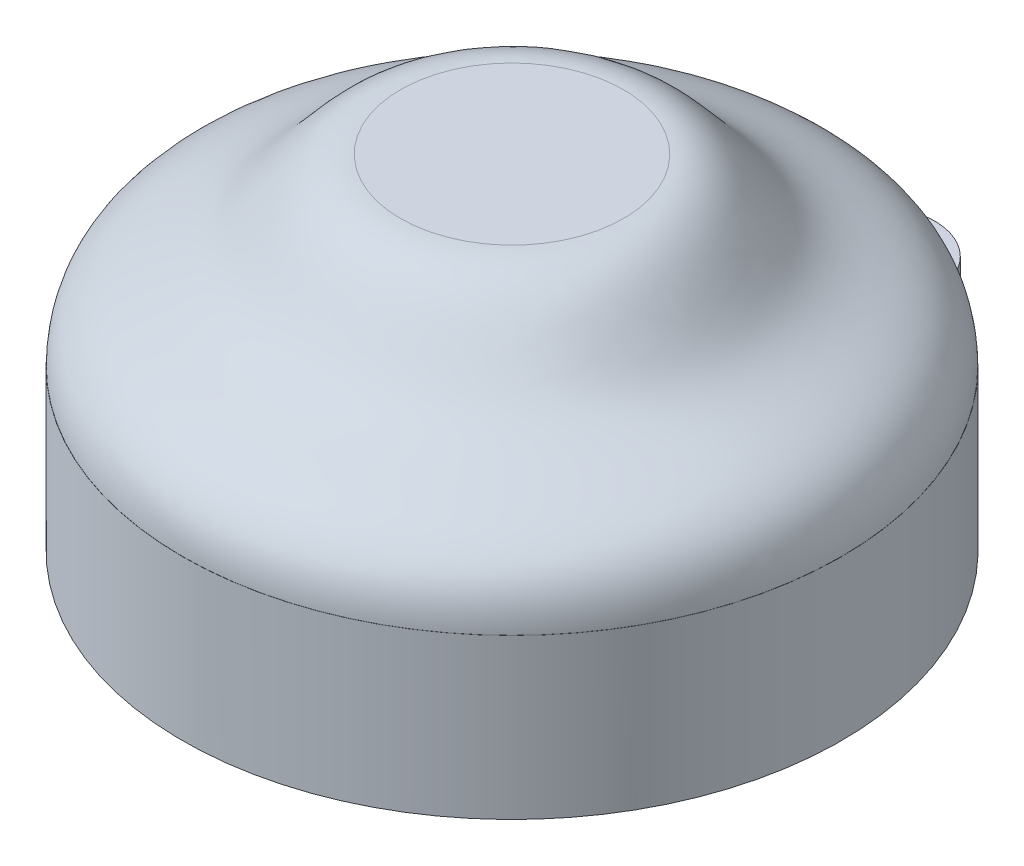
ISO-10303-21;
HEADER;
FILE_DESCRIPTION(('STEP AP214'),'2;1');
FILE_NAME('part.step','',(''),(''),'','','');
FILE_SCHEMA(('AUTOMOTIVE_DESIGN { 1 0 10303 214 1 1 1 1 }'));
ENDSEC;
DATA;
#1=APPLICATION_CONTEXT('core data for automotive mechanical design processes');
#2=APPLICATION_PROTOCOL_DEFINITION('international standard','automotive_design',2000,#1);
#3=PRODUCT_CONTEXT('',#1,'mechanical');
#4=PRODUCT('Part','Part','',(#3));
#5=PRODUCT_RELATED_PRODUCT_CATEGORY('part','',(#4));
#6=PRODUCT_DEFINITION_FORMATION('','',#4);
#7=PRODUCT_DEFINITION_CONTEXT('part definition',#1,'design');
#8=PRODUCT_DEFINITION('design','',#6,#7);
#9=PRODUCT_DEFINITION_SHAPE('','',#8);
#10=(LENGTH_UNIT() NAMED_UNIT(*) SI_UNIT(.MILLI.,.METRE.));
#11=(NAMED_UNIT(*) PLANE_ANGLE_UNIT() SI_UNIT($,.RADIAN.));
#12=(NAMED_UNIT(*) SI_UNIT($,.STERADIAN.) SOLID_ANGLE_UNIT());
#13=UNCERTAINTY_MEASURE_WITH_UNIT(LENGTH_MEASURE(1.E-05),#10,'distance_accuracy_value','');
#14=(GEOMETRIC_REPRESENTATION_CONTEXT(3) GLOBAL_UNCERTAINTY_ASSIGNED_CONTEXT((#13)) GLOBAL_UNIT_ASSIGNED_CONTEXT((#10,
#11,#12)) REPRESENTATION_CONTEXT('',''));
#15=CARTESIAN_POINT('',(0.,0.,0.));
#16=DIRECTION('',(0.,0.,1.));
#17=DIRECTION('',(1.,0.,0.));
#18=AXIS2_PLACEMENT_3D('',#15,#16,#17);
#19=CARTESIAN_POINT('',(-0.525640836433946,5.5,-29.9953946750342));
#20=DIRECTION('',(0.,-1.,0.));
#21=DIRECTION('',(0.,0.,-1.));
#22=AXIS2_PLACEMENT_3D('',#19,#20,#21);
#23=CYLINDRICAL_SURFACE('',#22,1.65);
#24=CARTESIAN_POINT('',(-0.525640836433946,5.5,-29.9953946750342));
#25=DIRECTION('',(0.,-1.,0.));
#26=DIRECTION('',(0.,0.,-1.));
#27=AXIS2_PLACEMENT_3D('',#24,#25,#26);
#28=CIRCLE('',#27,1.65);
#29=CARTESIAN_POINT('',(-0.525640836433946,5.5,-31.6453946750343));
#30=VERTEX_POINT('',#29);
#31=EDGE_CURVE('E198',#30,#30,#28,.T.);
#32=ORIENTED_EDGE('',*,*,#31,.F.);
#33=EDGE_LOOP('',(#32));
#34=FACE_BOUND('',#33,.T.);
#35=CARTESIAN_POINT('',(-0.525640836433946,3.5,-29.9953946750342));
#36=DIRECTION('',(0.,-1.,0.));
#37=DIRECTION('',(0.,0.,-1.));
#38=AXIS2_PLACEMENT_3D('',#35,#36,#37);
#39=CIRCLE('',#38,1.65);
#40=CARTESIAN_POINT('',(-0.525640836433946,3.5,-31.6453946750343));
#41=VERTEX_POINT('',#40);
#42=EDGE_CURVE('E196',#41,#41,#39,.F.);
#43=ORIENTED_EDGE('',*,*,#42,.F.);
#44=EDGE_LOOP('',(#43));
#45=FACE_BOUND('',#44,.T.);
#46=ADVANCED_FACE('F35',(#34,#45),#23,.F.);
#47=CARTESIAN_POINT('',(0.,13.,0.));
#48=DIRECTION('',(0.,1.,0.));
#49=DIRECTION('',(0.,0.,1.));
#50=AXIS2_PLACEMENT_3D('',#47,#48,#49);
#51=PLANE('',#50);
#52=CARTESIAN_POINT('',(0.,13.,0.));
#53=DIRECTION('',(0.,1.,0.));
#54=DIRECTION('',(0.,0.,1.));
#55=AXIS2_PLACEMENT_3D('',#52,#53,#54);
#56=CIRCLE('',#55,26.8651978123103);
#57=CARTESIAN_POINT('',(0.,13.,26.8651978123103));
#58=VERTEX_POINT('',#57);
#59=EDGE_CURVE('E226',#58,#58,#56,.T.);
#60=ORIENTED_EDGE('',*,*,#59,.F.);
#61=EDGE_LOOP('',(#60));
#62=FACE_BOUND('',#61,.T.);
#63=CARTESIAN_POINT('',(0.,13.,0.));
#64=DIRECTION('',(0.,1.,0.));
#65=DIRECTION('',(0.,0.,1.));
#66=AXIS2_PLACEMENT_3D('',#63,#64,#65);
#67=CIRCLE('',#66,26.878);
#68=CARTESIAN_POINT('',(0.,13.,26.878));
#69=VERTEX_POINT('',#68);
#70=EDGE_CURVE('E211',#69,#69,#67,.T.);
#71=ORIENTED_EDGE('',*,*,#70,.T.);
#72=EDGE_LOOP('',(#71));
#73=FACE_BOUND('',#72,.T.);
#74=ADVANCED_FACE('F300',(#62,#73),#51,.T.);
#75=CARTESIAN_POINT('',(0.,0.,0.));
#76=DIRECTION('',(0.,1.,0.));
#77=DIRECTION('',(0.,0.,1.));
#78=AXIS2_PLACEMENT_3D('',#75,#76,#77);
#79=PLANE('',#78);
#80=CARTESIAN_POINT('',(0.,0.,0.));
#81=DIRECTION('',(0.,1.,0.));
#82=DIRECTION('',(0.,0.,1.));
#83=AXIS2_PLACEMENT_3D('',#80,#81,#82);
#84=CIRCLE('',#83,26.878);
#85=CARTESIAN_POINT('',(-8.88915684801979,0.,-25.3655233443212));
#86=VERTEX_POINT('',#85);
#87=CARTESIAN_POINT('',(7.99495839794256,0.,-25.6614014468261));
#88=VERTEX_POINT('',#87);
#89=EDGE_CURVE('E210',#86,#88,#84,.T.);
#90=ORIENTED_EDGE('',*,*,#89,.F.);
#91=CARTESIAN_POINT('',(-10.5427688816569,0.,-30.0841637461965));
#92=DIRECTION('',(0.,1.,0.));
#93=DIRECTION('',(0.,0.,1.));
#94=AXIS2_PLACEMENT_3D('',#91,#92,#93);
#95=CIRCLE('',#94,5.);
#96=CARTESIAN_POINT('',(-5.54296519568378,0.,-30.0398568423421));
#97=VERTEX_POINT('',#96);
#98=EDGE_CURVE('E255',#86,#97,#95,.T.);
#99=ORIENTED_EDGE('',*,*,#98,.T.);
#100=CARTESIAN_POINT('',(-0.525640836433946,0.,-29.9953946750342));
#101=DIRECTION('',(0.,-1.,0.));
#102=DIRECTION('',(0.,0.,-1.));
#103=AXIS2_PLACEMENT_3D('',#100,#101,#102);
#104=CIRCLE('',#103,5.01752136121446);
#105=CARTESIAN_POINT('',(4.487045068531,0.,-30.2156232572148));
#106=VERTEX_POINT('',#105);
#107=EDGE_CURVE('E201',#97,#106,#104,.T.);
#108=ORIENTED_EDGE('',*,*,#107,.T.);
#109=CARTESIAN_POINT('',(9.48222649786491,0.,-30.4350827934341));
#110=DIRECTION('',(0.,1.,0.));
#111=DIRECTION('',(0.,0.,1.));
#112=AXIS2_PLACEMENT_3D('',#109,#110,#111);
#113=CIRCLE('',#112,5.);
#114=EDGE_CURVE('E251',#106,#88,#113,.T.);
#115=ORIENTED_EDGE('',*,*,#114,.T.);
#116=EDGE_LOOP('',(#90,#99,#108,#115));
#117=FACE_BOUND('',#116,.T.);
#118=CARTESIAN_POINT('',(0.,0.,0.));
#119=DIRECTION('',(0.,1.,0.));
#120=DIRECTION('',(0.,0.,1.));
#121=AXIS2_PLACEMENT_3D('',#118,#119,#120);
#122=CIRCLE('',#121,26.128);
#123=CARTESIAN_POINT('',(-8.15042277628501,0.,-24.8242420341048));
#124=VERTEX_POINT('',#123);
#125=CARTESIAN_POINT('',(7.26800541735761,0.,-25.0967822888366));
#126=VERTEX_POINT('',#125);
#127=EDGE_CURVE('E205',#124,#126,#122,.T.);
#128=ORIENTED_EDGE('',*,*,#127,.T.);
#129=CARTESIAN_POINT('',(8.65885152447595,0.,-29.89944270847));
#130=DIRECTION('',(0.,1.,0.));
#131=DIRECTION('',(0.,0.,1.));
#132=AXIS2_PLACEMENT_3D('',#129,#130,#131);
#133=CIRCLE('',#132,5.);
#134=CARTESIAN_POINT('',(3.65885152447595,0.,-29.89944270847));
#135=VERTEX_POINT('',#134);
#136=EDGE_CURVE('E11',#126,#135,#133,.F.);
#137=ORIENTED_EDGE('',*,*,#136,.T.);
#138=DIRECTION('',(0.,0.,1.));
#139=VECTOR('',#138,1.);
#140=CARTESIAN_POINT('',(3.65885152447595,0.,-29.9953946750342));
#141=LINE('',#140,#139);
#142=CARTESIAN_POINT('',(3.65885152447595,0.,-29.9953946750342));
#143=VERTEX_POINT('',#142);
#144=EDGE_CURVE('E189',#143,#135,#141,.T.);
#145=ORIENTED_EDGE('',*,*,#144,.F.);
#146=CARTESIAN_POINT('',(-0.525640836433946,0.,-29.9953946750342));
#147=DIRECTION('',(0.,-1.,0.));
#148=DIRECTION('',(0.,0.,-1.));
#149=AXIS2_PLACEMENT_3D('',#146,#147,#148);
#150=CIRCLE('',#149,4.1844923609099);
#151=CARTESIAN_POINT('',(-4.71013319734384,0.,-29.9953946750342));
#152=VERTEX_POINT('',#151);
#153=EDGE_CURVE('E176',#152,#143,#150,.T.);
#154=ORIENTED_EDGE('',*,*,#153,.F.);
#155=DIRECTION('',(0.,0.,-1.));
#156=VECTOR('',#155,1.);
#157=CARTESIAN_POINT('',(-4.71013319734384,0.,-29.9953946750342));
#158=LINE('',#157,#156);
#159=CARTESIAN_POINT('',(-4.71013319734384,0.,-29.5747476285063));
#160=VERTEX_POINT('',#159);
#161=EDGE_CURVE('E181',#160,#152,#158,.T.);
#162=ORIENTED_EDGE('',*,*,#161,.F.);
#163=CARTESIAN_POINT('',(-9.71013319734384,0.,-29.5747476285063));
#164=DIRECTION('',(0.,1.,0.));
#165=DIRECTION('',(0.,0.,1.));
#166=AXIS2_PLACEMENT_3D('',#163,#164,#165);
#167=CIRCLE('',#166,5.);
#168=EDGE_CURVE('E43',#160,#124,#167,.F.);
#169=ORIENTED_EDGE('',*,*,#168,.T.);
#170=EDGE_LOOP('',(#128,#137,#145,#154,#162,#169));
#171=FACE_BOUND('',#170,.T.);
#172=ADVANCED_FACE('F263',(#117,#171),#79,.F.);
#173=CARTESIAN_POINT('',(0.,13.,0.));
#174=DIRECTION('',(0.,-1.,0.));
#175=DIRECTION('',(0.,0.,-1.));
#176=AXIS2_PLACEMENT_3D('',#173,#174,#175);
#177=CYLINDRICAL_SURFACE('',#176,26.878);
#178=ORIENTED_EDGE('',*,*,#70,.F.);
#179=EDGE_LOOP('',(#178));
#180=FACE_BOUND('',#179,.T.);
#181=ORIENTED_EDGE('',*,*,#89,.T.);
#182=DIRECTION('',(0.,-1.,0.));
#183=VECTOR('',#182,1.);
#184=CARTESIAN_POINT('',(7.99495839794256,13.,-25.6614014468261));
#185=LINE('',#184,#183);
#186=CARTESIAN_POINT('',(7.99495839794256,5.5,-25.6614014468261));
#187=VERTEX_POINT('',#186);
#188=EDGE_CURVE('E244',#88,#187,#185,.F.);
#189=ORIENTED_EDGE('',*,*,#188,.T.);
#190=CARTESIAN_POINT('',(0.,5.5,0.));
#191=DIRECTION('',(0.,-1.,0.));
#192=DIRECTION('',(0.,0.,-1.));
#193=AXIS2_PLACEMENT_3D('',#190,#191,#192);
#194=CIRCLE('',#193,26.878);
#195=CARTESIAN_POINT('',(-8.88915684801979,5.5,-25.3655233443212));
#196=VERTEX_POINT('',#195);
#197=EDGE_CURVE('E214',#196,#187,#194,.T.);
#198=ORIENTED_EDGE('',*,*,#197,.F.);
#199=DIRECTION('',(0.,-1.,0.));
#200=VECTOR('',#199,1.);
#201=CARTESIAN_POINT('',(-8.88915684801979,13.,-25.3655233443212));
#202=LINE('',#201,#200);
#203=EDGE_CURVE('E241',#196,#86,#202,.T.);
#204=ORIENTED_EDGE('',*,*,#203,.T.);
#205=EDGE_LOOP('',(#181,#189,#198,#204));
#206=FACE_BOUND('',#205,.T.);
#207=ADVANCED_FACE('F322',(#180,#206),#177,.T.);
#208=CARTESIAN_POINT('',(0.,13.,0.));
#209=DIRECTION('',(0.,-1.,0.));
#210=DIRECTION('',(0.,0.,-1.));
#211=AXIS2_PLACEMENT_3D('',#208,#209,#210);
#212=CYLINDRICAL_SURFACE('',#211,26.128);
#213=CARTESIAN_POINT('',(0.,3.5,0.));
#214=DIRECTION('',(0.,-1.,0.));
#215=DIRECTION('',(0.,0.,-1.));
#216=AXIS2_PLACEMENT_3D('',#213,#214,#215);
#217=CIRCLE('',#216,26.128);
#218=CARTESIAN_POINT('',(7.26800541735761,3.5,-25.0967822888366));
#219=VERTEX_POINT('',#218);
#220=CARTESIAN_POINT('',(25.5952980480391,3.5,-5.24910486007355));
#221=VERTEX_POINT('',#220);
#222=EDGE_CURVE('E174',#219,#221,#217,.T.);
#223=ORIENTED_EDGE('',*,*,#222,.F.);
#224=DIRECTION('',(0.,-1.,0.));
#225=VECTOR('',#224,1.);
#226=CARTESIAN_POINT('',(7.26800541735761,13.,-25.0967822888366));
#227=LINE('',#226,#225);
#228=EDGE_CURVE('E234',#219,#126,#227,.T.);
#229=ORIENTED_EDGE('',*,*,#228,.T.);
#230=ORIENTED_EDGE('',*,*,#127,.F.);
#231=DIRECTION('',(0.,-1.,0.));
#232=VECTOR('',#231,1.);
#233=CARTESIAN_POINT('',(-8.15042277628501,13.,-24.8242420341048));
#234=LINE('',#233,#232);
#235=CARTESIAN_POINT('',(-8.15042277628501,3.5,-24.8242420341048));
#236=VERTEX_POINT('',#235);
#237=EDGE_CURVE('E232',#124,#236,#234,.F.);
#238=ORIENTED_EDGE('',*,*,#237,.T.);
#239=CARTESIAN_POINT('',(-25.5952980480391,3.5,-5.24910486007355));
#240=VERTEX_POINT('',#239);
#241=EDGE_CURVE('E172',#240,#236,#217,.T.);
#242=ORIENTED_EDGE('',*,*,#241,.F.);
#243=DIRECTION('',(0.,-1.,0.));
#244=VECTOR('',#243,1.);
#245=CARTESIAN_POINT('',(-25.5952980480391,13.,-5.24910486007355));
#246=LINE('',#245,#244);
#247=CARTESIAN_POINT('',(-25.5952980480391,5.,-5.24910486007355));
#248=VERTEX_POINT('',#247);
#249=EDGE_CURVE('E224',#248,#240,#246,.T.);
#250=ORIENTED_EDGE('',*,*,#249,.F.);
#251=CARTESIAN_POINT('',(0.,5.,0.));
#252=DIRECTION('',(0.,-1.,0.));
#253=DIRECTION('',(0.,0.,-1.));
#254=AXIS2_PLACEMENT_3D('',#251,#252,#253);
#255=CIRCLE('',#254,26.128);
#256=CARTESIAN_POINT('',(25.5952980480391,5.,-5.24910486007355));
#257=VERTEX_POINT('',#256);
#258=EDGE_CURVE('E156',#248,#257,#255,.T.);
#259=ORIENTED_EDGE('',*,*,#258,.T.);
#260=DIRECTION('',(0.,-1.,0.));
#261=VECTOR('',#260,1.);
#262=CARTESIAN_POINT('',(25.5952980480391,13.,-5.24910486007355));
#263=LINE('',#262,#261);
#264=EDGE_CURVE('E218',#221,#257,#263,.F.);
#265=ORIENTED_EDGE('',*,*,#264,.F.);
#266=EDGE_LOOP('',(#223,#229,#230,#238,#242,#250,#259,#265));
#267=FACE_BOUND('',#266,.T.);
#268=CARTESIAN_POINT('',(0.,13.,0.));
#269=DIRECTION('',(0.,-1.,0.));
#270=DIRECTION('',(0.,0.,-1.));
#271=AXIS2_PLACEMENT_3D('',#268,#269,#270);
#272=CIRCLE('',#271,26.128);
#273=CARTESIAN_POINT('',(0.,13.,-26.128));
#274=VERTEX_POINT('',#273);
#275=EDGE_CURVE('E165',#274,#274,#272,.T.);
#276=ORIENTED_EDGE('',*,*,#275,.F.);
#277=EDGE_LOOP('',(#276));
#278=FACE_BOUND('',#277,.T.);
#279=ADVANCED_FACE('F268',(#267,#278),#212,.F.);
#280=CARTESIAN_POINT('',(-0.525640836433946,5.5,-29.9953946750342));
#281=DIRECTION('',(0.,-1.,0.));
#282=DIRECTION('',(0.,0.,-1.));
#283=AXIS2_PLACEMENT_3D('',#280,#281,#282);
#284=PLANE('',#283);
#285=ORIENTED_EDGE('',*,*,#31,.T.);
#286=EDGE_LOOP('',(#285));
#287=FACE_BOUND('',#286,.T.);
#288=CARTESIAN_POINT('',(-0.525640836433946,5.5,-29.9953946750342));
#289=DIRECTION('',(0.,-1.,0.));
#290=DIRECTION('',(0.,0.,-1.));
#291=AXIS2_PLACEMENT_3D('',#288,#289,#290);
#292=CIRCLE('',#291,5.01752136121446);
#293=CARTESIAN_POINT('',(-5.54296519568378,5.5,-30.0398568423421));
#294=VERTEX_POINT('',#293);
#295=CARTESIAN_POINT('',(4.487045068531,5.5,-30.2156232572148));
#296=VERTEX_POINT('',#295);
#297=EDGE_CURVE('E202',#294,#296,#292,.T.);
#298=ORIENTED_EDGE('',*,*,#297,.F.);
#299=CARTESIAN_POINT('',(-10.5427688816569,5.5,-30.0841637461965));
#300=DIRECTION('',(0.,-1.,0.));
#301=DIRECTION('',(0.,0.,-1.));
#302=AXIS2_PLACEMENT_3D('',#299,#300,#301);
#303=CIRCLE('',#302,5.);
#304=EDGE_CURVE('E257',#294,#196,#303,.T.);
#305=ORIENTED_EDGE('',*,*,#304,.T.);
#306=ORIENTED_EDGE('',*,*,#197,.T.);
#307=CARTESIAN_POINT('',(9.48222649786491,5.5,-30.4350827934341));
#308=DIRECTION('',(0.,-1.,0.));
#309=DIRECTION('',(0.,0.,-1.));
#310=AXIS2_PLACEMENT_3D('',#307,#308,#309);
#311=CIRCLE('',#310,5.);
#312=EDGE_CURVE('E253',#187,#296,#311,.T.);
#313=ORIENTED_EDGE('',*,*,#312,.T.);
#314=EDGE_LOOP('',(#298,#305,#306,#313));
#315=FACE_BOUND('',#314,.T.);
#316=ADVANCED_FACE('F313',(#287,#315),#284,.F.);
#317=CARTESIAN_POINT('',(-0.525640836433946,5.5,-29.9953946750342));
#318=DIRECTION('',(0.,-1.,0.));
#319=DIRECTION('',(0.,0.,-1.));
#320=AXIS2_PLACEMENT_3D('',#317,#318,#319);
#321=CYLINDRICAL_SURFACE('',#320,5.01752136121446);
#322=ORIENTED_EDGE('',*,*,#297,.T.);
#323=DIRECTION('',(0.,-1.,0.));
#324=VECTOR('',#323,1.);
#325=CARTESIAN_POINT('',(4.487045068531,5.5,-30.2156232572148));
#326=LINE('',#325,#324);
#327=EDGE_CURVE('E238',#296,#106,#326,.T.);
#328=ORIENTED_EDGE('',*,*,#327,.T.);
#329=ORIENTED_EDGE('',*,*,#107,.F.);
#330=DIRECTION('',(0.,-1.,0.));
#331=VECTOR('',#330,1.);
#332=CARTESIAN_POINT('',(-5.54296519568378,5.5,-30.0398568423421));
#333=LINE('',#332,#331);
#334=EDGE_CURVE('E236',#97,#294,#333,.F.);
#335=ORIENTED_EDGE('',*,*,#334,.T.);
#336=EDGE_LOOP('',(#322,#328,#329,#335));
#337=FACE_BOUND('',#336,.T.);
#338=ADVANCED_FACE('F316',(#337),#321,.T.);
#339=CARTESIAN_POINT('',(-0.525640836433946,3.5,-29.9953946750342));
#340=DIRECTION('',(0.,-1.,0.));
#341=DIRECTION('',(0.,0.,-1.));
#342=AXIS2_PLACEMENT_3D('',#339,#340,#341);
#343=PLANE('',#342);
#344=DIRECTION('',(0.,0.,1.));
#345=VECTOR('',#344,1.);
#346=CARTESIAN_POINT('',(3.65885152447595,3.5,-29.9953946750342));
#347=LINE('',#346,#345);
#348=CARTESIAN_POINT('',(3.65885152447595,3.5,-29.9953946750342));
#349=VERTEX_POINT('',#348);
#350=CARTESIAN_POINT('',(3.65885152447595,3.5,-29.89944270847));
#351=VERTEX_POINT('',#350);
#352=EDGE_CURVE('E180',#349,#351,#347,.T.);
#353=ORIENTED_EDGE('',*,*,#352,.T.);
#354=CARTESIAN_POINT('',(8.65885152447595,3.5,-29.89944270847));
#355=DIRECTION('',(0.,-1.,0.));
#356=DIRECTION('',(0.,0.,-1.));
#357=AXIS2_PLACEMENT_3D('',#354,#355,#356);
#358=CIRCLE('',#357,5.);
#359=EDGE_CURVE('E249',#351,#219,#358,.F.);
#360=ORIENTED_EDGE('',*,*,#359,.T.);
#361=ORIENTED_EDGE('',*,*,#222,.T.);
#362=DIRECTION('',(-0.979611835886369,0.,0.200899604258786));
#363=VECTOR('',#362,1.);
#364=CARTESIAN_POINT('',(24.4902958971592,3.5,-5.02249010646964));
#365=LINE('',#364,#363);
#366=CARTESIAN_POINT('',(24.4902958971592,3.5,-5.02249010646964));
#367=VERTEX_POINT('',#366);
#368=EDGE_CURVE('E161',#221,#367,#365,.T.);
#369=ORIENTED_EDGE('',*,*,#368,.T.);
#370=CARTESIAN_POINT('',(0.,3.5,0.));
#371=DIRECTION('',(0.,1.,0.));
#372=DIRECTION('',(0.,0.,-1.));
#373=AXIS2_PLACEMENT_3D('',#370,#371,#372);
#374=CIRCLE('',#373,25.);
#375=CARTESIAN_POINT('',(-24.4902958971592,3.5,-5.02249010646965));
#376=VERTEX_POINT('',#375);
#377=EDGE_CURVE('E169',#367,#376,#374,.T.);
#378=ORIENTED_EDGE('',*,*,#377,.T.);
#379=DIRECTION('',(-0.97961183588637,0.,-0.200899604258785));
#380=VECTOR('',#379,1.);
#381=CARTESIAN_POINT('',(-24.4902958971592,3.5,-5.02249010646965));
#382=LINE('',#381,#380);
#383=EDGE_CURVE('E142',#376,#240,#382,.T.);
#384=ORIENTED_EDGE('',*,*,#383,.T.);
#385=ORIENTED_EDGE('',*,*,#241,.T.);
#386=CARTESIAN_POINT('',(-9.71013319734384,3.5,-29.5747476285063));
#387=DIRECTION('',(0.,-1.,0.));
#388=DIRECTION('',(0.,0.,-1.));
#389=AXIS2_PLACEMENT_3D('',#386,#387,#388);
#390=CIRCLE('',#389,5.);
#391=CARTESIAN_POINT('',(-4.71013319734384,3.5,-29.5747476285063));
#392=VERTEX_POINT('',#391);
#393=EDGE_CURVE('E50',#236,#392,#390,.F.);
#394=ORIENTED_EDGE('',*,*,#393,.T.);
#395=DIRECTION('',(0.,0.,-1.));
#396=VECTOR('',#395,1.);
#397=CARTESIAN_POINT('',(-4.71013319734384,3.5,-29.9953946750342));
#398=LINE('',#397,#396);
#399=CARTESIAN_POINT('',(-4.71013319734384,3.5,-29.9953946750342));
#400=VERTEX_POINT('',#399);
#401=EDGE_CURVE('E184',#392,#400,#398,.T.);
#402=ORIENTED_EDGE('',*,*,#401,.T.);
#403=CARTESIAN_POINT('',(-0.525640836433946,3.5,-29.9953946750342));
#404=DIRECTION('',(0.,-1.,0.));
#405=DIRECTION('',(0.,0.,-1.));
#406=AXIS2_PLACEMENT_3D('',#403,#404,#405);
#407=CIRCLE('',#406,4.1844923609099);
#408=EDGE_CURVE('E177',#400,#349,#407,.T.);
#409=ORIENTED_EDGE('',*,*,#408,.T.);
#410=EDGE_LOOP('',(#353,#360,#361,#369,#378,#384,#385,#394,#402,#409));
#411=FACE_BOUND('',#410,.T.);
#412=ORIENTED_EDGE('',*,*,#42,.T.);
#413=EDGE_LOOP('',(#412));
#414=FACE_BOUND('',#413,.T.);
#415=ADVANCED_FACE('F275',(#411,#414),#343,.T.);
#416=CARTESIAN_POINT('',(-0.525640836433946,3.5,-29.9953946750342));
#417=DIRECTION('',(0.,-1.,0.));
#418=DIRECTION('',(0.,0.,-1.));
#419=AXIS2_PLACEMENT_3D('',#416,#417,#418);
#420=CYLINDRICAL_SURFACE('',#419,4.1844923609099);
#421=ORIENTED_EDGE('',*,*,#153,.T.);
#422=DIRECTION('',(0.,-1.,0.));
#423=VECTOR('',#422,1.);
#424=CARTESIAN_POINT('',(3.65885152447595,3.5,-29.9953946750342));
#425=LINE('',#424,#423);
#426=EDGE_CURVE('E186',#349,#143,#425,.T.);
#427=ORIENTED_EDGE('',*,*,#426,.F.);
#428=ORIENTED_EDGE('',*,*,#408,.F.);
#429=DIRECTION('',(0.,-1.,0.));
#430=VECTOR('',#429,1.);
#431=CARTESIAN_POINT('',(-4.71013319734384,3.5,-29.9953946750342));
#432=LINE('',#431,#430);
#433=EDGE_CURVE('E193',#400,#152,#432,.T.);
#434=ORIENTED_EDGE('',*,*,#433,.T.);
#435=EDGE_LOOP('',(#421,#427,#428,#434));
#436=FACE_BOUND('',#435,.T.);
#437=ADVANCED_FACE('F279',(#436),#420,.F.);
#438=CARTESIAN_POINT('',(-4.71013319734384,3.5,-29.9953946750342));
#439=DIRECTION('',(-1.,0.,0.));
#440=DIRECTION('',(0.,0.,1.));
#441=AXIS2_PLACEMENT_3D('',#438,#439,#440);
#442=PLANE('',#441);
#443=ORIENTED_EDGE('',*,*,#401,.F.);
#444=DIRECTION('',(0.,1.,0.));
#445=VECTOR('',#444,1.);
#446=CARTESIAN_POINT('',(-4.71013319734384,0.,-29.5747476285063));
#447=LINE('',#446,#445);
#448=EDGE_CURVE('E247',#392,#160,#447,.F.);
#449=ORIENTED_EDGE('',*,*,#448,.T.);
#450=ORIENTED_EDGE('',*,*,#161,.T.);
#451=ORIENTED_EDGE('',*,*,#433,.F.);
#452=EDGE_LOOP('',(#443,#449,#450,#451));
#453=FACE_BOUND('',#452,.T.);
#454=ADVANCED_FACE('F272',(#453),#442,.F.);
#455=CARTESIAN_POINT('',(3.65885152447595,3.5,-29.9953946750342));
#456=DIRECTION('',(1.,0.,0.));
#457=DIRECTION('',(0.,0.,-1.));
#458=AXIS2_PLACEMENT_3D('',#455,#456,#457);
#459=PLANE('',#458);
#460=ORIENTED_EDGE('',*,*,#144,.T.);
#461=DIRECTION('',(0.,1.,0.));
#462=VECTOR('',#461,1.);
#463=CARTESIAN_POINT('',(3.65885152447595,3.5,-29.89944270847));
#464=LINE('',#463,#462);
#465=EDGE_CURVE('E229',#135,#351,#464,.T.);
#466=ORIENTED_EDGE('',*,*,#465,.T.);
#467=ORIENTED_EDGE('',*,*,#352,.F.);
#468=ORIENTED_EDGE('',*,*,#426,.T.);
#469=EDGE_LOOP('',(#460,#466,#467,#468));
#470=FACE_BOUND('',#469,.T.);
#471=ADVANCED_FACE('F282',(#470),#459,.F.);
#472=CARTESIAN_POINT('',(0.,5.,0.));
#473=DIRECTION('',(0.,-1.,0.));
#474=DIRECTION('',(0.,0.,-1.));
#475=AXIS2_PLACEMENT_3D('',#472,#473,#474);
#476=CYLINDRICAL_SURFACE('',#475,25.);
#477=ORIENTED_EDGE('',*,*,#377,.F.);
#478=DIRECTION('',(0.,-1.,0.));
#479=VECTOR('',#478,1.);
#480=CARTESIAN_POINT('',(24.4902958971592,5.,-5.02249010646964));
#481=LINE('',#480,#479);
#482=CARTESIAN_POINT('',(24.4902958971592,5.,-5.02249010646964));
#483=VERTEX_POINT('',#482);
#484=EDGE_CURVE('E147',#483,#367,#481,.T.);
#485=ORIENTED_EDGE('',*,*,#484,.F.);
#486=CARTESIAN_POINT('',(0.,5.,0.));
#487=DIRECTION('',(0.,1.,0.));
#488=DIRECTION('',(0.,0.,-1.));
#489=AXIS2_PLACEMENT_3D('',#486,#487,#488);
#490=CIRCLE('',#489,25.);
#491=CARTESIAN_POINT('',(-24.4902958971592,5.,-5.02249010646965));
#492=VERTEX_POINT('',#491);
#493=EDGE_CURVE('E155',#483,#492,#490,.T.);
#494=ORIENTED_EDGE('',*,*,#493,.T.);
#495=DIRECTION('',(0.,-1.,0.));
#496=VECTOR('',#495,1.);
#497=CARTESIAN_POINT('',(-24.4902958971592,5.,-5.02249010646965));
#498=LINE('',#497,#496);
#499=EDGE_CURVE('E136',#492,#376,#498,.T.);
#500=ORIENTED_EDGE('',*,*,#499,.T.);
#501=EDGE_LOOP('',(#477,#485,#494,#500));
#502=FACE_BOUND('',#501,.T.);
#503=ADVANCED_FACE('F159',(#502),#476,.F.);
#504=CARTESIAN_POINT('',(24.4902958971592,5.,-5.02249010646964));
#505=DIRECTION('',(0.200899604258786,0.,0.979611835886369));
#506=DIRECTION('',(0.97961183588637,0.,-0.200899604258786));
#507=AXIS2_PLACEMENT_3D('',#504,#505,#506);
#508=PLANE('',#507);
#509=ORIENTED_EDGE('',*,*,#368,.F.);
#510=ORIENTED_EDGE('',*,*,#264,.T.);
#511=DIRECTION('',(-0.979611835886369,0.,0.200899604258786));
#512=VECTOR('',#511,1.);
#513=CARTESIAN_POINT('',(24.4902958971592,5.,-5.02249010646964));
#514=LINE('',#513,#512);
#515=EDGE_CURVE('E148',#257,#483,#514,.T.);
#516=ORIENTED_EDGE('',*,*,#515,.T.);
#517=ORIENTED_EDGE('',*,*,#484,.T.);
#518=EDGE_LOOP('',(#509,#510,#516,#517));
#519=FACE_BOUND('',#518,.T.);
#520=ADVANCED_FACE('F289',(#519),#508,.T.);
#521=CARTESIAN_POINT('',(-24.4902958971592,5.,-5.02249010646965));
#522=DIRECTION('',(-0.200899604258785,0.,0.979611835886369));
#523=DIRECTION('',(0.97961183588637,0.,0.200899604258785));
#524=AXIS2_PLACEMENT_3D('',#521,#522,#523);
#525=PLANE('',#524);
#526=DIRECTION('',(-0.97961183588637,0.,-0.200899604258785));
#527=VECTOR('',#526,1.);
#528=CARTESIAN_POINT('',(-24.4902958971592,5.,-5.02249010646965));
#529=LINE('',#528,#527);
#530=EDGE_CURVE('E140',#492,#248,#529,.T.);
#531=ORIENTED_EDGE('',*,*,#530,.T.);
#532=ORIENTED_EDGE('',*,*,#249,.T.);
#533=ORIENTED_EDGE('',*,*,#383,.F.);
#534=ORIENTED_EDGE('',*,*,#499,.F.);
#535=EDGE_LOOP('',(#531,#532,#533,#534));
#536=FACE_BOUND('',#535,.T.);
#537=ADVANCED_FACE('F138',(#536),#525,.T.);
#538=CARTESIAN_POINT('',(0.,5.,0.));
#539=DIRECTION('',(0.,-1.,0.));
#540=DIRECTION('',(0.,0.,-1.));
#541=AXIS2_PLACEMENT_3D('',#538,#539,#540);
#542=PLANE('',#541);
#543=ORIENTED_EDGE('',*,*,#258,.F.);
#544=ORIENTED_EDGE('',*,*,#530,.F.);
#545=ORIENTED_EDGE('',*,*,#493,.F.);
#546=ORIENTED_EDGE('',*,*,#515,.F.);
#547=EDGE_LOOP('',(#543,#544,#545,#546));
#548=FACE_BOUND('',#547,.T.);
#549=ADVANCED_FACE('F153',(#548),#542,.F.);
#550=CARTESIAN_POINT('',(-8.97086398525368,27.25,0.));
#551=DIRECTION('',(0.,-1.,0.));
#552=DIRECTION('',(0.,0.,-1.));
#553=AXIS2_PLACEMENT_3D('',#550,#551,#552);
#554=PLANE('',#553);
#555=CARTESIAN_POINT('',(0.,27.25,0.));
#556=DIRECTION('',(0.,1.,0.));
#557=DIRECTION('',(0.,0.,1.));
#558=AXIS2_PLACEMENT_3D('',#555,#556,#557);
#559=CIRCLE('',#558,8.97086398525368);
#560=CARTESIAN_POINT('',(0.,27.25,8.97086398525368));
#561=VERTEX_POINT('',#560);
#562=EDGE_CURVE('E539',#561,#561,#559,.T.);
#563=ORIENTED_EDGE('',*,*,#562,.F.);
#564=EDGE_LOOP('',(#563));
#565=FACE_BOUND('',#564,.T.);
#566=ADVANCED_FACE('F469',(#565),#554,.T.);
#567=CARTESIAN_POINT('',(-26.0775637062389,13.,0.));
#568=CARTESIAN_POINT('',(-26.0086107684165,18.6883420476296,0.));
#569=CARTESIAN_POINT('',(-15.7421012466865,18.4987702992745,0.));
#570=CARTESIAN_POINT('',(-12.7221719741715,27.2856328319813,0.));
#571=CARTESIAN_POINT('',(-8.97086398525368,27.25,0.));
#572=B_SPLINE_CURVE_WITH_KNOTS('',3,(#567,#568,#569,#570,#571),.UNSPECIFIED.,.F.,.F.,(4,1,4),
(0.,0.57510098264286,1.),.UNSPECIFIED.);
#573=CARTESIAN_POINT('',(0.,30.1875,0.));
#574=DIRECTION('',(0.,1.,0.));
#575=AXIS1_PLACEMENT('',#573,#574);
#576=SURFACE_OF_REVOLUTION('',#572,#575);
#577=ORIENTED_EDGE('',*,*,#562,.T.);
#578=EDGE_LOOP('',(#577));
#579=FACE_BOUND('',#578,.T.);
#580=CARTESIAN_POINT('',(0.,13.,0.));
#581=DIRECTION('',(0.,1.,0.));
#582=DIRECTION('',(0.,0.,1.));
#583=AXIS2_PLACEMENT_3D('',#580,#581,#582);
#584=CIRCLE('',#583,26.0775637062389);
#585=CARTESIAN_POINT('',(0.,13.,26.0775637062389));
#586=VERTEX_POINT('',#585);
#587=EDGE_CURVE('E545',#586,#586,#584,.T.);
#588=ORIENTED_EDGE('',*,*,#587,.F.);
#589=EDGE_LOOP('',(#588));
#590=FACE_BOUND('',#589,.T.);
#591=ADVANCED_FACE('F459',(#579,#590),#576,.F.);
#592=CARTESIAN_POINT('',(-26.8651978123103,13.,0.));
#593=DIRECTION('',(0.,-1.,0.));
#594=DIRECTION('',(0.,0.,-1.));
#595=AXIS2_PLACEMENT_3D('',#592,#593,#594);
#596=PLANE('',#595);
#597=ORIENTED_EDGE('',*,*,#275,.T.);
#598=EDGE_LOOP('',(#597));
#599=FACE_BOUND('',#598,.T.);
#600=ORIENTED_EDGE('',*,*,#587,.T.);
#601=EDGE_LOOP('',(#600));
#602=FACE_BOUND('',#601,.T.);
#603=ADVANCED_FACE('F449',(#599,#602),#596,.T.);
#604=CARTESIAN_POINT('',(0.,28.,0.));
#605=DIRECTION('',(0.,1.,0.));
#606=DIRECTION('',(0.,0.,1.));
#607=AXIS2_PLACEMENT_3D('',#604,#605,#606);
#608=PLANE('',#607);
#609=CARTESIAN_POINT('',(0.,28.,0.));
#610=DIRECTION('',(0.,1.,0.));
#611=DIRECTION('',(0.,0.,1.));
#612=AXIS2_PLACEMENT_3D('',#609,#610,#611);
#613=CIRCLE('',#612,9.10113964911128);
#614=CARTESIAN_POINT('',(0.,28.,9.10113964911128));
#615=VERTEX_POINT('',#614);
#616=EDGE_CURVE('E547',#615,#615,#613,.T.);
#617=ORIENTED_EDGE('',*,*,#616,.T.);
#618=EDGE_LOOP('',(#617));
#619=FACE_BOUND('',#618,.T.);
#620=ADVANCED_FACE('F439',(#619),#608,.T.);
#621=CARTESIAN_POINT('',(-9.10113964911128,28.,0.));
#622=CARTESIAN_POINT('',(-13.0028480845971,28.0264305975457,0.));
#623=CARTESIAN_POINT('',(-16.2707277984136,18.725740026397,0.));
#624=CARTESIAN_POINT('',(-26.7803470858441,19.1839115479939,0.));
#625=CARTESIAN_POINT('',(-26.8651978123103,13.,0.));
#626=B_SPLINE_CURVE_WITH_KNOTS('',3,(#621,#622,#623,#624,#625),.UNSPECIFIED.,.F.,.F.,(4,1,4),
(0.,0.431406703677233,1.),.UNSPECIFIED.);
#627=CARTESIAN_POINT('',(0.,30.1875,0.));
#628=DIRECTION('',(0.,1.,0.));
#629=AXIS1_PLACEMENT('',#627,#628);
#630=SURFACE_OF_REVOLUTION('',#626,#629);
#631=ORIENTED_EDGE('',*,*,#59,.T.);
#632=EDGE_LOOP('',(#631));
#633=FACE_BOUND('',#632,.T.);
#634=ORIENTED_EDGE('',*,*,#616,.F.);
#635=EDGE_LOOP('',(#634));
#636=FACE_BOUND('',#635,.T.);
#637=ADVANCED_FACE('F333',(#633,#636),#630,.F.);
#638=CARTESIAN_POINT('',(8.65885152447595,13.,-29.89944270847));
#639=DIRECTION('',(0.,-1.,0.));
#640=DIRECTION('',(0.,0.,-1.));
#641=AXIS2_PLACEMENT_3D('',#638,#639,#640);
#642=CYLINDRICAL_SURFACE('',#641,5.);
#643=ORIENTED_EDGE('',*,*,#136,.F.);
#644=ORIENTED_EDGE('',*,*,#228,.F.);
#645=ORIENTED_EDGE('',*,*,#359,.F.);
#646=ORIENTED_EDGE('',*,*,#465,.F.);
#647=EDGE_LOOP('',(#643,#644,#645,#646));
#648=FACE_BOUND('',#647,.T.);
#649=ADVANCED_FACE('F285',(#648),#642,.T.);
#650=CARTESIAN_POINT('',(9.48222649786491,13.,-30.4350827934341));
#651=DIRECTION('',(0.,1.,0.));
#652=DIRECTION('',(0.,0.,1.));
#653=AXIS2_PLACEMENT_3D('',#650,#651,#652);
#654=CYLINDRICAL_SURFACE('',#653,5.);
#655=ORIENTED_EDGE('',*,*,#312,.F.);
#656=ORIENTED_EDGE('',*,*,#188,.F.);
#657=ORIENTED_EDGE('',*,*,#114,.F.);
#658=ORIENTED_EDGE('',*,*,#327,.F.);
#659=EDGE_LOOP('',(#655,#656,#657,#658));
#660=FACE_BOUND('',#659,.T.);
#661=ADVANCED_FACE('F332',(#660),#654,.F.);
#662=CARTESIAN_POINT('',(-10.5427688816569,5.5,-30.0841637461965));
#663=DIRECTION('',(0.,1.,0.));
#664=DIRECTION('',(0.,0.,1.));
#665=AXIS2_PLACEMENT_3D('',#662,#663,#664);
#666=CYLINDRICAL_SURFACE('',#665,5.);
#667=ORIENTED_EDGE('',*,*,#304,.F.);
#668=ORIENTED_EDGE('',*,*,#334,.F.);
#669=ORIENTED_EDGE('',*,*,#98,.F.);
#670=ORIENTED_EDGE('',*,*,#203,.F.);
#671=EDGE_LOOP('',(#667,#668,#669,#670));
#672=FACE_BOUND('',#671,.T.);
#673=ADVANCED_FACE('F335',(#672),#666,.F.);
#674=CARTESIAN_POINT('',(-9.71013319734384,13.,-29.5747476285063));
#675=DIRECTION('',(0.,-1.,0.));
#676=DIRECTION('',(0.,0.,-1.));
#677=AXIS2_PLACEMENT_3D('',#674,#675,#676);
#678=CYLINDRICAL_SURFACE('',#677,5.);
#679=ORIENTED_EDGE('',*,*,#393,.F.);
#680=ORIENTED_EDGE('',*,*,#237,.F.);
#681=ORIENTED_EDGE('',*,*,#168,.F.);
#682=ORIENTED_EDGE('',*,*,#448,.F.);
#683=EDGE_LOOP('',(#679,#680,#681,#682));
#684=FACE_BOUND('',#683,.T.);
#685=ADVANCED_FACE('F37',(#684),#678,.T.);
#686=CLOSED_SHELL('',(#46,#74,#172,#207,#279,#316,#338,#415,#437,#454,#471,#503,#520,#537,#549,
#566,#591,#603,#620,#637,#649,#661,#673,#685));
#687=MANIFOLD_SOLID_BREP('B2',#686);
#688=ADVANCED_BREP_SHAPE_REPRESENTATION('',(#18,#687),#14);
#689=SHAPE_DEFINITION_REPRESENTATION(#9,#688);
ENDSEC;
END-ISO-10303-21;
